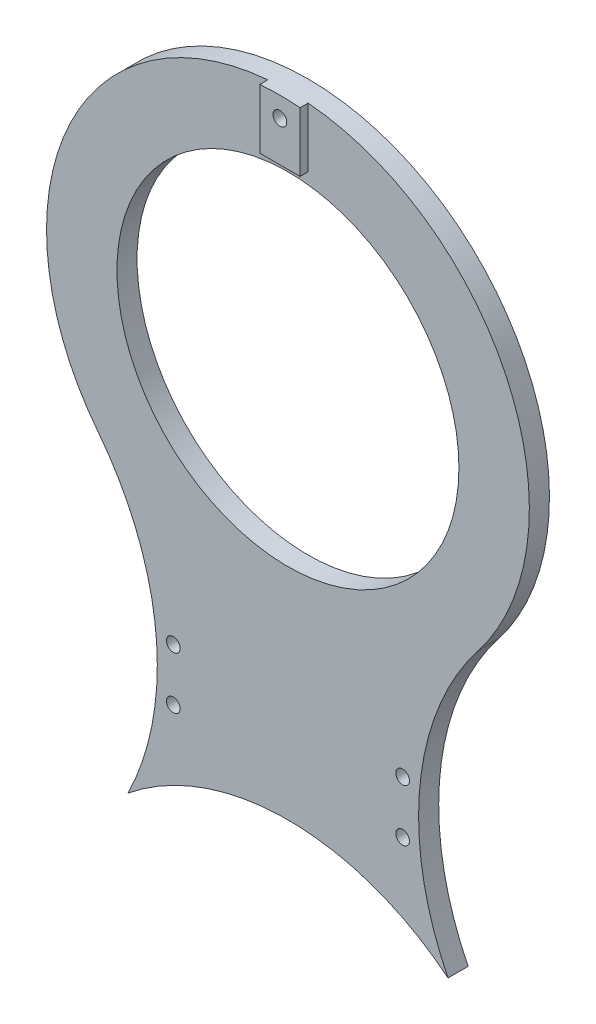
ISO-10303-21;
HEADER;
FILE_DESCRIPTION(('STEP AP214'),'2;1');
FILE_NAME('part.step','',(''),(''),'','','');
FILE_SCHEMA(('AUTOMOTIVE_DESIGN { 1 0 10303 214 1 1 1 1 }'));
ENDSEC;
DATA;
#1=APPLICATION_CONTEXT('core data for automotive mechanical design processes');
#2=APPLICATION_PROTOCOL_DEFINITION('international standard','automotive_design',2000,#1);
#3=PRODUCT_CONTEXT('',#1,'mechanical');
#4=PRODUCT('Part','Part','',(#3));
#5=PRODUCT_RELATED_PRODUCT_CATEGORY('part','',(#4));
#6=PRODUCT_DEFINITION_FORMATION('','',#4);
#7=PRODUCT_DEFINITION_CONTEXT('part definition',#1,'design');
#8=PRODUCT_DEFINITION('design','',#6,#7);
#9=PRODUCT_DEFINITION_SHAPE('','',#8);
#10=(LENGTH_UNIT() NAMED_UNIT(*) SI_UNIT(.MILLI.,.METRE.));
#11=(NAMED_UNIT(*) PLANE_ANGLE_UNIT() SI_UNIT($,.RADIAN.));
#12=(NAMED_UNIT(*) SI_UNIT($,.STERADIAN.) SOLID_ANGLE_UNIT());
#13=UNCERTAINTY_MEASURE_WITH_UNIT(LENGTH_MEASURE(1.E-05),#10,'distance_accuracy_value','');
#14=(GEOMETRIC_REPRESENTATION_CONTEXT(3) GLOBAL_UNCERTAINTY_ASSIGNED_CONTEXT((#13)) GLOBAL_UNIT_ASSIGNED_CONTEXT((#10,
#11,#12)) REPRESENTATION_CONTEXT('',''));
#15=CARTESIAN_POINT('',(0.,0.,0.));
#16=DIRECTION('',(0.,0.,1.));
#17=DIRECTION('',(1.,0.,0.));
#18=AXIS2_PLACEMENT_3D('',#15,#16,#17);
#19=CARTESIAN_POINT('',(102.46950036777,79.999990660129,0.));
#20=DIRECTION('',(0.,0.,-1.));
#21=DIRECTION('',(1.,0.,0.));
#22=AXIS2_PLACEMENT_3D('',#19,#20,#21);
#23=CYLINDRICAL_SURFACE('',#22,70.);
#24=DIRECTION('',(0.,0.,1.));
#25=VECTOR('',#24,1.);
#26=CARTESIAN_POINT('',(47.293569885537,123.07686027046,0.));
#27=LINE('',#26,#25);
#28=CARTESIAN_POINT('',(47.293569885537,123.07686027046,0.));
#29=VERTEX_POINT('',#28);
#30=CARTESIAN_POINT('',(47.293569885537,123.07686027046,5.));
#31=VERTEX_POINT('',#30);
#32=EDGE_CURVE('E10',#29,#31,#27,.T.);
#33=ORIENTED_EDGE('',*,*,#32,.T.);
#34=CARTESIAN_POINT('',(102.46950036777,79.999990660129,5.));
#35=DIRECTION('',(0.,0.,1.));
#36=DIRECTION('',(1.,0.,0.));
#37=AXIS2_PLACEMENT_3D('',#34,#35,#36);
#38=CIRCLE('',#37,70.);
#39=CARTESIAN_POINT('',(39.782,48.850716228117,5.));
#40=VERTEX_POINT('',#39);
#41=EDGE_CURVE('E26',#31,#40,#38,.T.);
#42=ORIENTED_EDGE('',*,*,#41,.T.);
#43=DIRECTION('',(0.,0.,1.));
#44=VECTOR('',#43,1.);
#45=CARTESIAN_POINT('',(39.782,48.850716228117,0.));
#46=LINE('',#45,#44);
#47=CARTESIAN_POINT('',(39.782,48.850716228117,0.));
#48=VERTEX_POINT('',#47);
#49=EDGE_CURVE('E166',#48,#40,#46,.T.);
#50=ORIENTED_EDGE('',*,*,#49,.F.);
#51=CARTESIAN_POINT('',(102.46950036777,79.999990660129,0.));
#52=DIRECTION('',(0.,0.,1.));
#53=DIRECTION('',(1.,0.,0.));
#54=AXIS2_PLACEMENT_3D('',#51,#52,#53);
#55=CIRCLE('',#54,70.);
#56=EDGE_CURVE('E168',#29,#48,#55,.T.);
#57=ORIENTED_EDGE('',*,*,#56,.F.);
#58=EDGE_LOOP('',(#33,#42,#50,#57));
#59=FACE_BOUND('',#58,.T.);
#60=ADVANCED_FACE('F15',(#59),#23,.F.);
#61=CARTESIAN_POINT('',(0.,160.,0.));
#62=DIRECTION('',(0.,0.,-1.));
#63=DIRECTION('',(1.,0.,0.));
#64=AXIS2_PLACEMENT_3D('',#61,#62,#63);
#65=CYLINDRICAL_SURFACE('',#64,60.);
#66=DIRECTION('',(0.,0.,1.));
#67=VECTOR('',#66,1.);
#68=CARTESIAN_POINT('',(-4.999999999857,219.79130371553,5.));
#69=LINE('',#68,#67);
#70=CARTESIAN_POINT('',(-4.999999999857,219.79130371553,5.));
#71=VERTEX_POINT('',#70);
#72=CARTESIAN_POINT('',(-4.999999999857,219.79130371553,7.));
#73=VERTEX_POINT('',#72);
#74=EDGE_CURVE('E209',#71,#73,#69,.T.);
#75=ORIENTED_EDGE('',*,*,#74,.T.);
#76=CARTESIAN_POINT('',(0.,160.,7.));
#77=DIRECTION('',(0.,0.,1.));
#78=DIRECTION('',(1.,0.,0.));
#79=AXIS2_PLACEMENT_3D('',#76,#77,#78);
#80=CIRCLE('',#79,60.);
#81=CARTESIAN_POINT('',(4.999999999872,219.79130371552,7.));
#82=VERTEX_POINT('',#81);
#83=EDGE_CURVE('E272',#82,#73,#80,.T.);
#84=ORIENTED_EDGE('',*,*,#83,.F.);
#85=DIRECTION('',(0.,0.,1.));
#86=VECTOR('',#85,1.);
#87=CARTESIAN_POINT('',(4.999999999872,219.79130371552,5.));
#88=LINE('',#87,#86);
#89=CARTESIAN_POINT('',(4.999999999872,219.79130371552,5.));
#90=VERTEX_POINT('',#89);
#91=EDGE_CURVE('E177',#90,#82,#88,.T.);
#92=ORIENTED_EDGE('',*,*,#91,.F.);
#93=CARTESIAN_POINT('',(0.,160.,5.));
#94=DIRECTION('',(0.,0.,1.));
#95=DIRECTION('',(1.,0.,0.));
#96=AXIS2_PLACEMENT_3D('',#93,#94,#95);
#97=CIRCLE('',#96,60.);
#98=EDGE_CURVE('E161',#31,#90,#97,.T.);
#99=ORIENTED_EDGE('',*,*,#98,.F.);
#100=ORIENTED_EDGE('',*,*,#32,.F.);
#101=CARTESIAN_POINT('',(0.,160.,0.));
#102=DIRECTION('',(0.,0.,1.));
#103=DIRECTION('',(1.,0.,0.));
#104=AXIS2_PLACEMENT_3D('',#101,#102,#103);
#105=CIRCLE('',#104,60.);
#106=CARTESIAN_POINT('',(-47.29356988553,123.07686027046,0.));
#107=VERTEX_POINT('',#106);
#108=EDGE_CURVE('E202',#29,#107,#105,.T.);
#109=ORIENTED_EDGE('',*,*,#108,.T.);
#110=DIRECTION('',(0.,0.,1.));
#111=VECTOR('',#110,1.);
#112=CARTESIAN_POINT('',(-47.29356988553,123.07686027046,0.));
#113=LINE('',#112,#111);
#114=CARTESIAN_POINT('',(-47.29356988553,123.07686027046,5.));
#115=VERTEX_POINT('',#114);
#116=EDGE_CURVE('E200',#107,#115,#113,.T.);
#117=ORIENTED_EDGE('',*,*,#116,.T.);
#118=CARTESIAN_POINT('',(0.,160.,5.));
#119=DIRECTION('',(0.,0.,1.));
#120=DIRECTION('',(1.,0.,0.));
#121=AXIS2_PLACEMENT_3D('',#118,#119,#120);
#122=CIRCLE('',#121,60.);
#123=EDGE_CURVE('E174',#71,#115,#122,.T.);
#124=ORIENTED_EDGE('',*,*,#123,.F.);
#125=EDGE_LOOP('',(#75,#84,#92,#99,#100,#109,#117,#124));
#126=FACE_BOUND('',#125,.T.);
#127=ADVANCED_FACE('F396',(#126),#65,.T.);
#128=CARTESIAN_POINT('',(0.,0.,0.));
#129=DIRECTION('',(0.,0.,-1.));
#130=DIRECTION('',(1.,0.,0.));
#131=AXIS2_PLACEMENT_3D('',#128,#129,#130);
#132=CYLINDRICAL_SURFACE('',#131,63.);
#133=ORIENTED_EDGE('',*,*,#49,.T.);
#134=CARTESIAN_POINT('',(0.,0.,5.));
#135=DIRECTION('',(0.,0.,1.));
#136=DIRECTION('',(1.,0.,0.));
#137=AXIS2_PLACEMENT_3D('',#134,#135,#136);
#138=CIRCLE('',#137,63.);
#139=CARTESIAN_POINT('',(-39.782,48.850716228117,5.));
#140=VERTEX_POINT('',#139);
#141=EDGE_CURVE('E163',#40,#140,#138,.T.);
#142=ORIENTED_EDGE('',*,*,#141,.T.);
#143=DIRECTION('',(0.,0.,1.));
#144=VECTOR('',#143,1.);
#145=CARTESIAN_POINT('',(-39.782,48.850716228117,0.));
#146=LINE('',#145,#144);
#147=CARTESIAN_POINT('',(-39.782,48.850716228117,0.));
#148=VERTEX_POINT('',#147);
#149=EDGE_CURVE('E150',#148,#140,#146,.T.);
#150=ORIENTED_EDGE('',*,*,#149,.F.);
#151=CARTESIAN_POINT('',(0.,0.,0.));
#152=DIRECTION('',(0.,0.,1.));
#153=DIRECTION('',(1.,0.,0.));
#154=AXIS2_PLACEMENT_3D('',#151,#152,#153);
#155=CIRCLE('',#154,63.);
#156=EDGE_CURVE('E240',#48,#148,#155,.T.);
#157=ORIENTED_EDGE('',*,*,#156,.F.);
#158=EDGE_LOOP('',(#133,#142,#150,#157));
#159=FACE_BOUND('',#158,.T.);
#160=ADVANCED_FACE('F164',(#159),#132,.F.);
#161=CARTESIAN_POINT('',(47.293569885571,123.07686027043,0.));
#162=DIRECTION('',(0.,0.,-1.));
#163=DIRECTION('',(0.,-1.,0.));
#164=AXIS2_PLACEMENT_3D('',#161,#162,#163);
#165=PLANE('',#164);
#166=ORIENTED_EDGE('',*,*,#56,.T.);
#167=ORIENTED_EDGE('',*,*,#156,.T.);
#168=CARTESIAN_POINT('',(-102.4695003677,79.999990660129,0.));
#169=DIRECTION('',(0.,0.,1.));
#170=DIRECTION('',(1.,0.,0.));
#171=AXIS2_PLACEMENT_3D('',#168,#169,#170);
#172=CIRCLE('',#171,70.);
#173=EDGE_CURVE('E156',#148,#107,#172,.T.);
#174=ORIENTED_EDGE('',*,*,#173,.T.);
#175=ORIENTED_EDGE('',*,*,#108,.F.);
#176=EDGE_LOOP('',(#166,#167,#174,#175));
#177=FACE_BOUND('',#176,.T.);
#178=CARTESIAN_POINT('',(-28.5,86.5,0.));
#179=DIRECTION('',(0.,0.,1.));
#180=DIRECTION('',(1.,0.,0.));
#181=AXIS2_PLACEMENT_3D('',#178,#179,#180);
#182=CIRCLE('',#181,1.7);
#183=CARTESIAN_POINT('',(-26.8,86.5,0.));
#184=VERTEX_POINT('',#183);
#185=EDGE_CURVE('E231',#184,#184,#182,.T.);
#186=ORIENTED_EDGE('',*,*,#185,.T.);
#187=EDGE_LOOP('',(#186));
#188=FACE_BOUND('',#187,.T.);
#189=CARTESIAN_POINT('',(0.,215.,0.));
#190=DIRECTION('',(0.,0.,1.));
#191=DIRECTION('',(1.,0.,0.));
#192=AXIS2_PLACEMENT_3D('',#189,#190,#191);
#193=CIRCLE('',#192,2.95);
#194=CARTESIAN_POINT('',(2.95,215.,0.));
#195=VERTEX_POINT('',#194);
#196=EDGE_CURVE('E227',#195,#195,#193,.T.);
#197=ORIENTED_EDGE('',*,*,#196,.T.);
#198=EDGE_LOOP('',(#197));
#199=FACE_BOUND('',#198,.T.);
#200=CARTESIAN_POINT('',(0.,160.,0.));
#201=DIRECTION('',(0.,0.,1.));
#202=DIRECTION('',(1.,0.,0.));
#203=AXIS2_PLACEMENT_3D('',#200,#201,#202);
#204=CIRCLE('',#203,42.5);
#205=CARTESIAN_POINT('',(42.5,160.,0.));
#206=VERTEX_POINT('',#205);
#207=EDGE_CURVE('E232',#206,#206,#204,.T.);
#208=ORIENTED_EDGE('',*,*,#207,.T.);
#209=EDGE_LOOP('',(#208));
#210=FACE_BOUND('',#209,.T.);
#211=CARTESIAN_POINT('',(28.5,73.5,0.));
#212=DIRECTION('',(0.,0.,1.));
#213=DIRECTION('',(1.,0.,0.));
#214=AXIS2_PLACEMENT_3D('',#211,#212,#213);
#215=CIRCLE('',#214,1.7);
#216=CARTESIAN_POINT('',(30.2,73.5,0.));
#217=VERTEX_POINT('',#216);
#218=EDGE_CURVE('E187',#217,#217,#215,.T.);
#219=ORIENTED_EDGE('',*,*,#218,.T.);
#220=EDGE_LOOP('',(#219));
#221=FACE_BOUND('',#220,.T.);
#222=CARTESIAN_POINT('',(-28.5,73.5,0.));
#223=DIRECTION('',(0.,0.,1.));
#224=DIRECTION('',(1.,0.,0.));
#225=AXIS2_PLACEMENT_3D('',#222,#223,#224);
#226=CIRCLE('',#225,1.7);
#227=CARTESIAN_POINT('',(-26.8,73.5,0.));
#228=VERTEX_POINT('',#227);
#229=EDGE_CURVE('E198',#228,#228,#226,.T.);
#230=ORIENTED_EDGE('',*,*,#229,.T.);
#231=EDGE_LOOP('',(#230));
#232=FACE_BOUND('',#231,.T.);
#233=CARTESIAN_POINT('',(28.5,86.5,0.));
#234=DIRECTION('',(0.,0.,1.));
#235=DIRECTION('',(1.,0.,0.));
#236=AXIS2_PLACEMENT_3D('',#233,#234,#235);
#237=CIRCLE('',#236,1.7);
#238=CARTESIAN_POINT('',(30.2,86.5,0.));
#239=VERTEX_POINT('',#238);
#240=EDGE_CURVE('E195',#239,#239,#237,.T.);
#241=ORIENTED_EDGE('',*,*,#240,.T.);
#242=EDGE_LOOP('',(#241));
#243=FACE_BOUND('',#242,.T.);
#244=ADVANCED_FACE('F334',(#177,#188,#199,#210,#221,#232,#243),#165,.T.);
#245=CARTESIAN_POINT('',(47.293569885571,123.07686027043,5.));
#246=DIRECTION('',(0.,0.,-1.));
#247=DIRECTION('',(0.,-1.,0.));
#248=AXIS2_PLACEMENT_3D('',#245,#246,#247);
#249=PLANE('',#248);
#250=DIRECTION('',(0.,-1.,0.));
#251=VECTOR('',#250,1.);
#252=CARTESIAN_POINT('',(5.,219.79130371552,5.));
#253=LINE('',#252,#251);
#254=CARTESIAN_POINT('',(5.,205.,5.));
#255=VERTEX_POINT('',#254);
#256=EDGE_CURVE('E199',#90,#255,#253,.T.);
#257=ORIENTED_EDGE('',*,*,#256,.T.);
#258=DIRECTION('',(-1.,0.,0.));
#259=VECTOR('',#258,1.);
#260=CARTESIAN_POINT('',(5.,205.,5.));
#261=LINE('',#260,#259);
#262=CARTESIAN_POINT('',(-5.,205.,5.));
#263=VERTEX_POINT('',#262);
#264=EDGE_CURVE('E233',#255,#263,#261,.T.);
#265=ORIENTED_EDGE('',*,*,#264,.T.);
#266=DIRECTION('',(0.,1.,0.));
#267=VECTOR('',#266,1.);
#268=CARTESIAN_POINT('',(-5.,205.,5.));
#269=LINE('',#268,#267);
#270=EDGE_CURVE('E237',#263,#71,#269,.T.);
#271=ORIENTED_EDGE('',*,*,#270,.T.);
#272=ORIENTED_EDGE('',*,*,#123,.T.);
#273=CARTESIAN_POINT('',(-102.4695003677,79.999990660129,5.));
#274=DIRECTION('',(0.,0.,1.));
#275=DIRECTION('',(1.,0.,0.));
#276=AXIS2_PLACEMENT_3D('',#273,#274,#275);
#277=CIRCLE('',#276,70.);
#278=EDGE_CURVE('E154',#140,#115,#277,.T.);
#279=ORIENTED_EDGE('',*,*,#278,.F.);
#280=ORIENTED_EDGE('',*,*,#141,.F.);
#281=ORIENTED_EDGE('',*,*,#41,.F.);
#282=ORIENTED_EDGE('',*,*,#98,.T.);
#283=EDGE_LOOP('',(#257,#265,#271,#272,#279,#280,#281,#282));
#284=FACE_BOUND('',#283,.T.);
#285=CARTESIAN_POINT('',(-28.5,73.5,5.));
#286=DIRECTION('',(0.,0.,1.));
#287=DIRECTION('',(1.,0.,0.));
#288=AXIS2_PLACEMENT_3D('',#285,#286,#287);
#289=CIRCLE('',#288,1.7);
#290=CARTESIAN_POINT('',(-26.8,73.5,5.));
#291=VERTEX_POINT('',#290);
#292=EDGE_CURVE('E194',#291,#291,#289,.T.);
#293=ORIENTED_EDGE('',*,*,#292,.F.);
#294=EDGE_LOOP('',(#293));
#295=FACE_BOUND('',#294,.T.);
#296=CARTESIAN_POINT('',(-28.5,86.5,5.));
#297=DIRECTION('',(0.,0.,1.));
#298=DIRECTION('',(1.,0.,0.));
#299=AXIS2_PLACEMENT_3D('',#296,#297,#298);
#300=CIRCLE('',#299,1.7);
#301=CARTESIAN_POINT('',(-26.8,86.5,5.));
#302=VERTEX_POINT('',#301);
#303=EDGE_CURVE('E221',#302,#302,#300,.T.);
#304=ORIENTED_EDGE('',*,*,#303,.F.);
#305=EDGE_LOOP('',(#304));
#306=FACE_BOUND('',#305,.T.);
#307=CARTESIAN_POINT('',(28.5,86.5,5.));
#308=DIRECTION('',(0.,0.,1.));
#309=DIRECTION('',(1.,0.,0.));
#310=AXIS2_PLACEMENT_3D('',#307,#308,#309);
#311=CIRCLE('',#310,1.7);
#312=CARTESIAN_POINT('',(30.2,86.5,5.));
#313=VERTEX_POINT('',#312);
#314=EDGE_CURVE('E290',#313,#313,#311,.T.);
#315=ORIENTED_EDGE('',*,*,#314,.F.);
#316=EDGE_LOOP('',(#315));
#317=FACE_BOUND('',#316,.T.);
#318=CARTESIAN_POINT('',(28.5,73.5,5.));
#319=DIRECTION('',(0.,0.,1.));
#320=DIRECTION('',(1.,0.,0.));
#321=AXIS2_PLACEMENT_3D('',#318,#319,#320);
#322=CIRCLE('',#321,1.7);
#323=CARTESIAN_POINT('',(30.2,73.5,5.));
#324=VERTEX_POINT('',#323);
#325=EDGE_CURVE('E193',#324,#324,#322,.T.);
#326=ORIENTED_EDGE('',*,*,#325,.F.);
#327=EDGE_LOOP('',(#326));
#328=FACE_BOUND('',#327,.T.);
#329=CARTESIAN_POINT('',(0.,160.,5.));
#330=DIRECTION('',(0.,0.,1.));
#331=DIRECTION('',(1.,0.,0.));
#332=AXIS2_PLACEMENT_3D('',#329,#330,#331);
#333=CIRCLE('',#332,42.5);
#334=CARTESIAN_POINT('',(42.5,160.,5.));
#335=VERTEX_POINT('',#334);
#336=EDGE_CURVE('E250',#335,#335,#333,.T.);
#337=ORIENTED_EDGE('',*,*,#336,.F.);
#338=EDGE_LOOP('',(#337));
#339=FACE_BOUND('',#338,.T.);
#340=ADVANCED_FACE('F171',(#284,#295,#306,#317,#328,#339),#249,.F.);
#341=CARTESIAN_POINT('',(-102.4695003677,79.999990660129,0.));
#342=DIRECTION('',(0.,0.,-1.));
#343=DIRECTION('',(1.,0.,0.));
#344=AXIS2_PLACEMENT_3D('',#341,#342,#343);
#345=CYLINDRICAL_SURFACE('',#344,70.);
#346=ORIENTED_EDGE('',*,*,#149,.T.);
#347=ORIENTED_EDGE('',*,*,#278,.T.);
#348=ORIENTED_EDGE('',*,*,#116,.F.);
#349=ORIENTED_EDGE('',*,*,#173,.F.);
#350=EDGE_LOOP('',(#346,#347,#348,#349));
#351=FACE_BOUND('',#350,.T.);
#352=ADVANCED_FACE('F152',(#351),#345,.F.);
#353=CARTESIAN_POINT('',(5.,219.79130371552,5.));
#354=DIRECTION('',(1.,0.,0.));
#355=DIRECTION('',(0.,1.,0.));
#356=AXIS2_PLACEMENT_3D('',#353,#354,#355);
#357=PLANE('',#356);
#358=ORIENTED_EDGE('',*,*,#91,.T.);
#359=DIRECTION('',(0.,-1.,0.));
#360=VECTOR('',#359,1.);
#361=CARTESIAN_POINT('',(5.,219.79130371552,7.));
#362=LINE('',#361,#360);
#363=CARTESIAN_POINT('',(5.,205.,7.));
#364=VERTEX_POINT('',#363);
#365=EDGE_CURVE('E19',#82,#364,#362,.T.);
#366=ORIENTED_EDGE('',*,*,#365,.T.);
#367=DIRECTION('',(0.,0.,1.));
#368=VECTOR('',#367,1.);
#369=CARTESIAN_POINT('',(5.,205.,5.));
#370=LINE('',#369,#368);
#371=EDGE_CURVE('E287',#255,#364,#370,.T.);
#372=ORIENTED_EDGE('',*,*,#371,.F.);
#373=ORIENTED_EDGE('',*,*,#256,.F.);
#374=EDGE_LOOP('',(#358,#366,#372,#373));
#375=FACE_BOUND('',#374,.T.);
#376=ADVANCED_FACE('F383',(#375),#357,.T.);
#377=CARTESIAN_POINT('',(4.999999999743,219.79130371552,7.));
#378=DIRECTION('',(0.,0.,-1.));
#379=DIRECTION('',(0.,-1.,0.));
#380=AXIS2_PLACEMENT_3D('',#377,#378,#379);
#381=PLANE('',#380);
#382=DIRECTION('',(0.,1.,0.));
#383=VECTOR('',#382,1.);
#384=CARTESIAN_POINT('',(-5.,205.,7.));
#385=LINE('',#384,#383);
#386=CARTESIAN_POINT('',(-5.,205.,7.));
#387=VERTEX_POINT('',#386);
#388=EDGE_CURVE('E258',#387,#73,#385,.T.);
#389=ORIENTED_EDGE('',*,*,#388,.F.);
#390=DIRECTION('',(-1.,0.,0.));
#391=VECTOR('',#390,1.);
#392=CARTESIAN_POINT('',(5.,205.,7.));
#393=LINE('',#392,#391);
#394=EDGE_CURVE('E266',#364,#387,#393,.T.);
#395=ORIENTED_EDGE('',*,*,#394,.F.);
#396=ORIENTED_EDGE('',*,*,#365,.F.);
#397=ORIENTED_EDGE('',*,*,#83,.T.);
#398=EDGE_LOOP('',(#389,#395,#396,#397));
#399=FACE_BOUND('',#398,.T.);
#400=CARTESIAN_POINT('',(0.,215.,7.));
#401=DIRECTION('',(0.,0.,1.));
#402=DIRECTION('',(1.,0.,0.));
#403=AXIS2_PLACEMENT_3D('',#400,#401,#402);
#404=CIRCLE('',#403,1.7);
#405=CARTESIAN_POINT('',(1.7,215.,7.));
#406=VERTEX_POINT('',#405);
#407=EDGE_CURVE('E267',#406,#406,#404,.T.);
#408=ORIENTED_EDGE('',*,*,#407,.F.);
#409=EDGE_LOOP('',(#408));
#410=FACE_BOUND('',#409,.T.);
#411=ADVANCED_FACE('F17',(#399,#410),#381,.F.);
#412=CARTESIAN_POINT('',(-5.,205.,5.));
#413=DIRECTION('',(-1.,0.,0.));
#414=DIRECTION('',(0.,0.,1.));
#415=AXIS2_PLACEMENT_3D('',#412,#413,#414);
#416=PLANE('',#415);
#417=DIRECTION('',(0.,0.,1.));
#418=VECTOR('',#417,1.);
#419=CARTESIAN_POINT('',(-5.,205.,5.));
#420=LINE('',#419,#418);
#421=EDGE_CURVE('E262',#263,#387,#420,.T.);
#422=ORIENTED_EDGE('',*,*,#421,.T.);
#423=ORIENTED_EDGE('',*,*,#388,.T.);
#424=ORIENTED_EDGE('',*,*,#74,.F.);
#425=ORIENTED_EDGE('',*,*,#270,.F.);
#426=EDGE_LOOP('',(#422,#423,#424,#425));
#427=FACE_BOUND('',#426,.T.);
#428=ADVANCED_FACE('F382',(#427),#416,.T.);
#429=CARTESIAN_POINT('',(-28.5,86.5,-25.));
#430=DIRECTION('',(0.,0.,1.));
#431=DIRECTION('',(1.,0.,0.));
#432=AXIS2_PLACEMENT_3D('',#429,#430,#431);
#433=CYLINDRICAL_SURFACE('',#432,1.7);
#434=DIRECTION('',(0.,0.,1.));
#435=VECTOR('',#434,1.);
#436=CARTESIAN_POINT('',(-26.8,86.5,-25.));
#437=LINE('',#436,#435);
#438=EDGE_CURVE('E225',#184,#302,#437,.T.);
#439=ORIENTED_EDGE('',*,*,#438,.T.);
#440=ORIENTED_EDGE('',*,*,#303,.T.);
#441=ORIENTED_EDGE('',*,*,#438,.F.);
#442=ORIENTED_EDGE('',*,*,#185,.F.);
#443=EDGE_LOOP('',(#439,#440,#441,#442));
#444=FACE_BOUND('',#443,.T.);
#445=ADVANCED_FACE('F366',(#444),#433,.F.);
#446=CARTESIAN_POINT('',(0.,215.,-4.));
#447=DIRECTION('',(0.,0.,1.));
#448=DIRECTION('',(1.,0.,0.));
#449=AXIS2_PLACEMENT_3D('',#446,#447,#448);
#450=CYLINDRICAL_SURFACE('',#449,2.95);
#451=ORIENTED_EDGE('',*,*,#196,.F.);
#452=DIRECTION('',(0.,0.,1.));
#453=VECTOR('',#452,1.);
#454=CARTESIAN_POINT('',(2.95,215.,-4.));
#455=LINE('',#454,#453);
#456=CARTESIAN_POINT('',(2.95,215.,3.));
#457=VERTEX_POINT('',#456);
#458=EDGE_CURVE('E226',#195,#457,#455,.T.);
#459=ORIENTED_EDGE('',*,*,#458,.T.);
#460=CARTESIAN_POINT('',(0.,215.,3.));
#461=DIRECTION('',(0.,0.,1.));
#462=DIRECTION('',(1.,0.,0.));
#463=AXIS2_PLACEMENT_3D('',#460,#461,#462);
#464=CIRCLE('',#463,2.95);
#465=EDGE_CURVE('E257',#457,#457,#464,.T.);
#466=ORIENTED_EDGE('',*,*,#465,.T.);
#467=ORIENTED_EDGE('',*,*,#458,.F.);
#468=EDGE_LOOP('',(#451,#459,#466,#467));
#469=FACE_BOUND('',#468,.T.);
#470=ADVANCED_FACE('F371',(#469),#450,.F.);
#471=CARTESIAN_POINT('',(0.,160.,0.));
#472=DIRECTION('',(0.,0.,-1.));
#473=DIRECTION('',(1.,0.,0.));
#474=AXIS2_PLACEMENT_3D('',#471,#472,#473);
#475=CYLINDRICAL_SURFACE('',#474,42.5);
#476=DIRECTION('',(0.,0.,1.));
#477=VECTOR('',#476,1.);
#478=CARTESIAN_POINT('',(42.5,160.,0.));
#479=LINE('',#478,#477);
#480=EDGE_CURVE('E312',#206,#335,#479,.T.);
#481=ORIENTED_EDGE('',*,*,#480,.T.);
#482=ORIENTED_EDGE('',*,*,#336,.T.);
#483=ORIENTED_EDGE('',*,*,#480,.F.);
#484=ORIENTED_EDGE('',*,*,#207,.F.);
#485=EDGE_LOOP('',(#481,#482,#483,#484));
#486=FACE_BOUND('',#485,.T.);
#487=ADVANCED_FACE('F338',(#486),#475,.F.);
#488=CARTESIAN_POINT('',(28.5,73.5,-25.));
#489=DIRECTION('',(0.,0.,1.));
#490=DIRECTION('',(1.,0.,0.));
#491=AXIS2_PLACEMENT_3D('',#488,#489,#490);
#492=CYLINDRICAL_SURFACE('',#491,1.7);
#493=DIRECTION('',(0.,0.,1.));
#494=VECTOR('',#493,1.);
#495=CARTESIAN_POINT('',(30.2,73.5,-25.));
#496=LINE('',#495,#494);
#497=EDGE_CURVE('E247',#217,#324,#496,.T.);
#498=ORIENTED_EDGE('',*,*,#497,.T.);
#499=ORIENTED_EDGE('',*,*,#325,.T.);
#500=ORIENTED_EDGE('',*,*,#497,.F.);
#501=ORIENTED_EDGE('',*,*,#218,.F.);
#502=EDGE_LOOP('',(#498,#499,#500,#501));
#503=FACE_BOUND('',#502,.T.);
#504=ADVANCED_FACE('F330',(#503),#492,.F.);
#505=CARTESIAN_POINT('',(-28.5,73.5,-25.));
#506=DIRECTION('',(0.,0.,1.));
#507=DIRECTION('',(1.,0.,0.));
#508=AXIS2_PLACEMENT_3D('',#505,#506,#507);
#509=CYLINDRICAL_SURFACE('',#508,1.7);
#510=DIRECTION('',(0.,0.,1.));
#511=VECTOR('',#510,1.);
#512=CARTESIAN_POINT('',(-26.8,73.5,-25.));
#513=LINE('',#512,#511);
#514=EDGE_CURVE('E189',#228,#291,#513,.T.);
#515=ORIENTED_EDGE('',*,*,#514,.T.);
#516=ORIENTED_EDGE('',*,*,#292,.T.);
#517=ORIENTED_EDGE('',*,*,#514,.F.);
#518=ORIENTED_EDGE('',*,*,#229,.F.);
#519=EDGE_LOOP('',(#515,#516,#517,#518));
#520=FACE_BOUND('',#519,.T.);
#521=ADVANCED_FACE('F361',(#520),#509,.F.);
#522=CARTESIAN_POINT('',(28.5,86.5,-25.));
#523=DIRECTION('',(0.,0.,1.));
#524=DIRECTION('',(1.,0.,0.));
#525=AXIS2_PLACEMENT_3D('',#522,#523,#524);
#526=CYLINDRICAL_SURFACE('',#525,1.7);
#527=DIRECTION('',(0.,0.,1.));
#528=VECTOR('',#527,1.);
#529=CARTESIAN_POINT('',(30.2,86.5,-25.));
#530=LINE('',#529,#528);
#531=EDGE_CURVE('E216',#239,#313,#530,.T.);
#532=ORIENTED_EDGE('',*,*,#531,.T.);
#533=ORIENTED_EDGE('',*,*,#314,.T.);
#534=ORIENTED_EDGE('',*,*,#531,.F.);
#535=ORIENTED_EDGE('',*,*,#240,.F.);
#536=EDGE_LOOP('',(#532,#533,#534,#535));
#537=FACE_BOUND('',#536,.T.);
#538=ADVANCED_FACE('F352',(#537),#526,.F.);
#539=CARTESIAN_POINT('',(5.,205.,5.));
#540=DIRECTION('',(0.,-1.,0.));
#541=DIRECTION('',(0.,0.,-1.));
#542=AXIS2_PLACEMENT_3D('',#539,#540,#541);
#543=PLANE('',#542);
#544=ORIENTED_EDGE('',*,*,#371,.T.);
#545=ORIENTED_EDGE('',*,*,#394,.T.);
#546=ORIENTED_EDGE('',*,*,#421,.F.);
#547=ORIENTED_EDGE('',*,*,#264,.F.);
#548=EDGE_LOOP('',(#544,#545,#546,#547));
#549=FACE_BOUND('',#548,.T.);
#550=ADVANCED_FACE('F406',(#549),#543,.T.);
#551=CARTESIAN_POINT('',(0.,215.,2.));
#552=DIRECTION('',(0.,0.,1.));
#553=DIRECTION('',(1.,0.,0.));
#554=AXIS2_PLACEMENT_3D('',#551,#552,#553);
#555=CYLINDRICAL_SURFACE('',#554,1.7);
#556=DIRECTION('',(0.,0.,1.));
#557=VECTOR('',#556,1.);
#558=CARTESIAN_POINT('',(1.7,215.,2.));
#559=LINE('',#558,#557);
#560=CARTESIAN_POINT('',(1.7,215.,3.));
#561=VERTEX_POINT('',#560);
#562=EDGE_CURVE('E263',#561,#406,#559,.T.);
#563=ORIENTED_EDGE('',*,*,#562,.T.);
#564=ORIENTED_EDGE('',*,*,#407,.T.);
#565=ORIENTED_EDGE('',*,*,#562,.F.);
#566=CARTESIAN_POINT('',(0.,215.,3.));
#567=DIRECTION('',(0.,0.,1.));
#568=DIRECTION('',(1.,0.,0.));
#569=AXIS2_PLACEMENT_3D('',#566,#567,#568);
#570=CIRCLE('',#569,1.7);
#571=EDGE_CURVE('E293',#561,#561,#570,.T.);
#572=ORIENTED_EDGE('',*,*,#571,.F.);
#573=EDGE_LOOP('',(#563,#564,#565,#572));
#574=FACE_BOUND('',#573,.T.);
#575=ADVANCED_FACE('F376',(#574),#555,.F.);
#576=CARTESIAN_POINT('',(0.,215.,3.));
#577=DIRECTION('',(0.,0.,1.));
#578=DIRECTION('',(1.,0.,0.));
#579=AXIS2_PLACEMENT_3D('',#576,#577,#578);
#580=PLANE('',#579);
#581=ORIENTED_EDGE('',*,*,#465,.F.);
#582=EDGE_LOOP('',(#581));
#583=FACE_BOUND('',#582,.T.);
#584=ORIENTED_EDGE('',*,*,#571,.T.);
#585=EDGE_LOOP('',(#584));
#586=FACE_BOUND('',#585,.T.);
#587=ADVANCED_FACE('F373',(#583,#586),#580,.F.);
#588=CLOSED_SHELL('',(#60,#127,#160,#244,#340,#352,#376,#411,#428,#445,#470,#487,#504,#521,#538,
#550,#575,#587));
#589=MANIFOLD_SOLID_BREP('B1',#588);
#590=ADVANCED_BREP_SHAPE_REPRESENTATION('',(#18,#589),#14);
#591=SHAPE_DEFINITION_REPRESENTATION(#9,#590);
ENDSEC;
END-ISO-10303-21;
